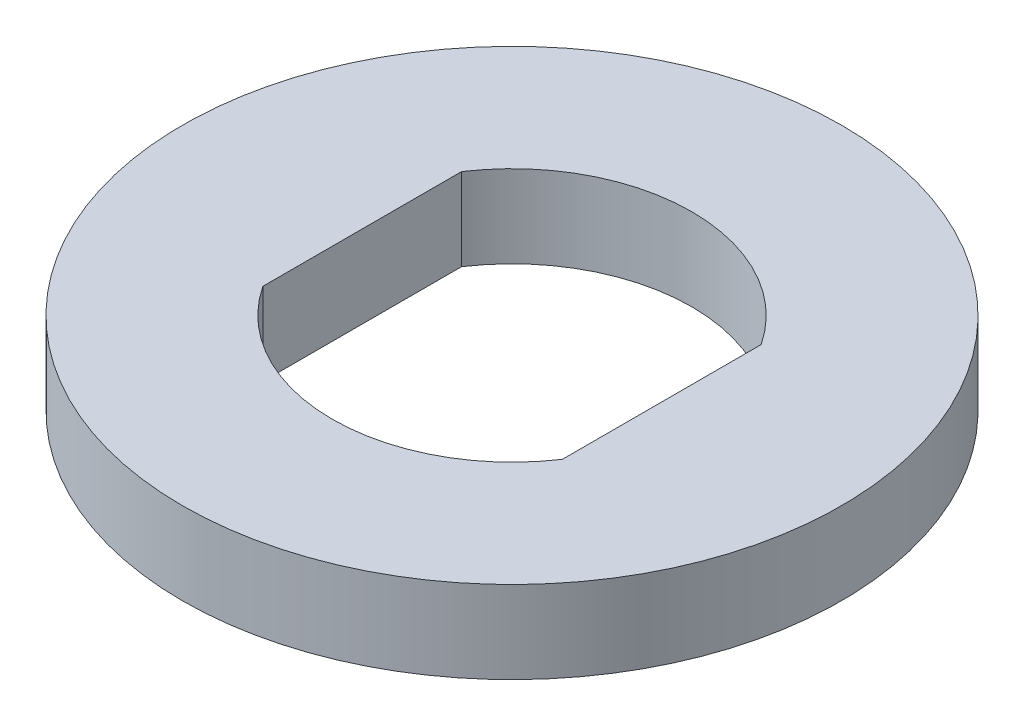
ISO-10303-21;
HEADER;
FILE_DESCRIPTION(('STEP AP214'),'2;1');
FILE_NAME('part.step','',(''),(''),'','','');
FILE_SCHEMA(('AUTOMOTIVE_DESIGN { 1 0 10303 214 1 1 1 1 }'));
ENDSEC;
DATA;
#1=APPLICATION_CONTEXT('core data for automotive mechanical design processes');
#2=APPLICATION_PROTOCOL_DEFINITION('international standard','automotive_design',2000,#1);
#3=PRODUCT_CONTEXT('',#1,'mechanical');
#4=PRODUCT('Part','Part','',(#3));
#5=PRODUCT_RELATED_PRODUCT_CATEGORY('part','',(#4));
#6=PRODUCT_DEFINITION_FORMATION('','',#4);
#7=PRODUCT_DEFINITION_CONTEXT('part definition',#1,'design');
#8=PRODUCT_DEFINITION('design','',#6,#7);
#9=PRODUCT_DEFINITION_SHAPE('','',#8);
#10=(LENGTH_UNIT() NAMED_UNIT(*) SI_UNIT(.MILLI.,.METRE.));
#11=(NAMED_UNIT(*) PLANE_ANGLE_UNIT() SI_UNIT($,.RADIAN.));
#12=(NAMED_UNIT(*) SI_UNIT($,.STERADIAN.) SOLID_ANGLE_UNIT());
#13=UNCERTAINTY_MEASURE_WITH_UNIT(LENGTH_MEASURE(1.E-05),#10,'distance_accuracy_value','');
#14=(GEOMETRIC_REPRESENTATION_CONTEXT(3) GLOBAL_UNCERTAINTY_ASSIGNED_CONTEXT((#13)) GLOBAL_UNIT_ASSIGNED_CONTEXT((#10,
#11,#12)) REPRESENTATION_CONTEXT('',''));
#15=CARTESIAN_POINT('',(0.,0.,0.));
#16=DIRECTION('',(0.,0.,1.));
#17=DIRECTION('',(1.,0.,0.));
#18=AXIS2_PLACEMENT_3D('',#15,#16,#17);
#19=CARTESIAN_POINT('',(0.,1.375,0.));
#20=DIRECTION('',(0.,1.,0.));
#21=DIRECTION('',(0.,0.,1.));
#22=AXIS2_PLACEMENT_3D('',#19,#20,#21);
#23=PLANE('',#22);
#24=CARTESIAN_POINT('',(0.,1.375,0.));
#25=DIRECTION('',(0.,1.,0.));
#26=DIRECTION('',(0.,0.,1.));
#27=AXIS2_PLACEMENT_3D('',#24,#25,#26);
#28=CIRCLE('',#27,11.);
#29=CARTESIAN_POINT('',(0.,1.375,11.));
#30=VERTEX_POINT('',#29);
#31=EDGE_CURVE('E11',#30,#30,#28,.T.);
#32=ORIENTED_EDGE('',*,*,#31,.T.);
#33=EDGE_LOOP('',(#32));
#34=FACE_BOUND('',#33,.T.);
#35=DIRECTION('',(0.,0.,1.));
#36=VECTOR('',#35,1.);
#37=CARTESIAN_POINT('',(-5.,1.375,-3.3166247903554));
#38=LINE('',#37,#36);
#39=CARTESIAN_POINT('',(-5.,1.375,-3.3166247903554));
#40=VERTEX_POINT('',#39);
#41=CARTESIAN_POINT('',(-5.,1.375,3.3166247903554));
#42=VERTEX_POINT('',#41);
#43=EDGE_CURVE('E90',#40,#42,#38,.T.);
#44=ORIENTED_EDGE('',*,*,#43,.F.);
#45=CARTESIAN_POINT('',(0.,1.375,0.));
#46=DIRECTION('',(0.,1.,0.));
#47=DIRECTION('',(0.,0.,1.));
#48=AXIS2_PLACEMENT_3D('',#45,#46,#47);
#49=CIRCLE('',#48,6.);
#50=CARTESIAN_POINT('',(5.,1.375,-3.3166247903554));
#51=VERTEX_POINT('',#50);
#52=EDGE_CURVE('E81',#51,#40,#49,.T.);
#53=ORIENTED_EDGE('',*,*,#52,.F.);
#54=DIRECTION('',(0.,0.,-1.));
#55=VECTOR('',#54,1.);
#56=CARTESIAN_POINT('',(5.,1.375,3.3166247903554));
#57=LINE('',#56,#55);
#58=CARTESIAN_POINT('',(5.,1.375,3.3166247903554));
#59=VERTEX_POINT('',#58);
#60=EDGE_CURVE('E106',#59,#51,#57,.T.);
#61=ORIENTED_EDGE('',*,*,#60,.F.);
#62=CARTESIAN_POINT('',(0.,1.375,0.));
#63=DIRECTION('',(0.,1.,0.));
#64=DIRECTION('',(0.,0.,1.));
#65=AXIS2_PLACEMENT_3D('',#62,#63,#64);
#66=CIRCLE('',#65,6.);
#67=EDGE_CURVE('E102',#42,#59,#66,.T.);
#68=ORIENTED_EDGE('',*,*,#67,.F.);
#69=EDGE_LOOP('',(#44,#53,#61,#68));
#70=FACE_BOUND('',#69,.T.);
#71=ADVANCED_FACE('F39',(#34,#70),#23,.T.);
#72=CARTESIAN_POINT('',(0.,-1.375,0.));
#73=DIRECTION('',(0.,1.,0.));
#74=DIRECTION('',(0.,0.,1.));
#75=AXIS2_PLACEMENT_3D('',#72,#73,#74);
#76=PLANE('',#75);
#77=CARTESIAN_POINT('',(0.,-1.375,0.));
#78=DIRECTION('',(0.,1.,0.));
#79=DIRECTION('',(0.,0.,1.));
#80=AXIS2_PLACEMENT_3D('',#77,#78,#79);
#81=CIRCLE('',#80,11.);
#82=CARTESIAN_POINT('',(0.,-1.375,11.));
#83=VERTEX_POINT('',#82);
#84=EDGE_CURVE('E43',#83,#83,#81,.T.);
#85=ORIENTED_EDGE('',*,*,#84,.F.);
#86=EDGE_LOOP('',(#85));
#87=FACE_BOUND('',#86,.T.);
#88=CARTESIAN_POINT('',(0.,-1.375,0.));
#89=DIRECTION('',(0.,1.,0.));
#90=DIRECTION('',(0.,0.,1.));
#91=AXIS2_PLACEMENT_3D('',#88,#89,#90);
#92=CIRCLE('',#91,6.);
#93=CARTESIAN_POINT('',(5.,-1.375,-3.3166247903554));
#94=VERTEX_POINT('',#93);
#95=CARTESIAN_POINT('',(-5.,-1.375,-3.3166247903554));
#96=VERTEX_POINT('',#95);
#97=EDGE_CURVE('E63',#94,#96,#92,.T.);
#98=ORIENTED_EDGE('',*,*,#97,.T.);
#99=DIRECTION('',(0.,0.,1.));
#100=VECTOR('',#99,1.);
#101=CARTESIAN_POINT('',(-5.,-1.375,-3.3166247903554));
#102=LINE('',#101,#100);
#103=CARTESIAN_POINT('',(-5.,-1.375,3.3166247903554));
#104=VERTEX_POINT('',#103);
#105=EDGE_CURVE('E97',#96,#104,#102,.T.);
#106=ORIENTED_EDGE('',*,*,#105,.T.);
#107=CARTESIAN_POINT('',(0.,-1.375,0.));
#108=DIRECTION('',(0.,1.,0.));
#109=DIRECTION('',(0.,0.,1.));
#110=AXIS2_PLACEMENT_3D('',#107,#108,#109);
#111=CIRCLE('',#110,6.);
#112=CARTESIAN_POINT('',(5.,-1.375,3.3166247903554));
#113=VERTEX_POINT('',#112);
#114=EDGE_CURVE('E115',#104,#113,#111,.T.);
#115=ORIENTED_EDGE('',*,*,#114,.T.);
#116=DIRECTION('',(0.,0.,-1.));
#117=VECTOR('',#116,1.);
#118=CARTESIAN_POINT('',(5.,-1.375,3.3166247903554));
#119=LINE('',#118,#117);
#120=EDGE_CURVE('E91',#113,#94,#119,.T.);
#121=ORIENTED_EDGE('',*,*,#120,.T.);
#122=EDGE_LOOP('',(#98,#106,#115,#121));
#123=FACE_BOUND('',#122,.T.);
#124=ADVANCED_FACE('F131',(#87,#123),#76,.F.);
#125=CARTESIAN_POINT('',(0.,1.375,0.));
#126=DIRECTION('',(0.,-1.,0.));
#127=DIRECTION('',(0.,0.,-1.));
#128=AXIS2_PLACEMENT_3D('',#125,#126,#127);
#129=CYLINDRICAL_SURFACE('',#128,11.);
#130=ORIENTED_EDGE('',*,*,#31,.F.);
#131=EDGE_LOOP('',(#130));
#132=FACE_BOUND('',#131,.T.);
#133=ORIENTED_EDGE('',*,*,#84,.T.);
#134=EDGE_LOOP('',(#133));
#135=FACE_BOUND('',#134,.T.);
#136=ADVANCED_FACE('F41',(#132,#135),#129,.T.);
#137=CARTESIAN_POINT('',(0.,1.375,0.));
#138=DIRECTION('',(0.,-1.,0.));
#139=DIRECTION('',(0.,0.,-1.));
#140=AXIS2_PLACEMENT_3D('',#137,#138,#139);
#141=CYLINDRICAL_SURFACE('',#140,6.);
#142=ORIENTED_EDGE('',*,*,#97,.F.);
#143=DIRECTION('',(0.,-1.,0.));
#144=VECTOR('',#143,1.);
#145=CARTESIAN_POINT('',(5.,1.375,-3.3166247903554));
#146=LINE('',#145,#144);
#147=EDGE_CURVE('E85',#51,#94,#146,.T.);
#148=ORIENTED_EDGE('',*,*,#147,.F.);
#149=ORIENTED_EDGE('',*,*,#52,.T.);
#150=DIRECTION('',(0.,-1.,0.));
#151=VECTOR('',#150,1.);
#152=CARTESIAN_POINT('',(-5.,1.375,-3.3166247903554));
#153=LINE('',#152,#151);
#154=EDGE_CURVE('E84',#40,#96,#153,.T.);
#155=ORIENTED_EDGE('',*,*,#154,.T.);
#156=EDGE_LOOP('',(#142,#148,#149,#155));
#157=FACE_BOUND('',#156,.T.);
#158=ADVANCED_FACE('F83',(#157),#141,.F.);
#159=CARTESIAN_POINT('',(-5.,1.375,-3.3166247903554));
#160=DIRECTION('',(1.,0.,0.));
#161=DIRECTION('',(0.,0.,-1.));
#162=AXIS2_PLACEMENT_3D('',#159,#160,#161);
#163=PLANE('',#162);
#164=ORIENTED_EDGE('',*,*,#105,.F.);
#165=ORIENTED_EDGE('',*,*,#154,.F.);
#166=ORIENTED_EDGE('',*,*,#43,.T.);
#167=DIRECTION('',(0.,-1.,0.));
#168=VECTOR('',#167,1.);
#169=CARTESIAN_POINT('',(-5.,1.375,3.3166247903554));
#170=LINE('',#169,#168);
#171=EDGE_CURVE('E99',#42,#104,#170,.T.);
#172=ORIENTED_EDGE('',*,*,#171,.T.);
#173=EDGE_LOOP('',(#164,#165,#166,#172));
#174=FACE_BOUND('',#173,.T.);
#175=ADVANCED_FACE('F94',(#174),#163,.T.);
#176=CARTESIAN_POINT('',(0.,1.375,0.));
#177=DIRECTION('',(0.,-1.,0.));
#178=DIRECTION('',(0.,0.,-1.));
#179=AXIS2_PLACEMENT_3D('',#176,#177,#178);
#180=CYLINDRICAL_SURFACE('',#179,6.);
#181=ORIENTED_EDGE('',*,*,#114,.F.);
#182=ORIENTED_EDGE('',*,*,#171,.F.);
#183=ORIENTED_EDGE('',*,*,#67,.T.);
#184=DIRECTION('',(0.,-1.,0.));
#185=VECTOR('',#184,1.);
#186=CARTESIAN_POINT('',(5.,1.375,3.3166247903554));
#187=LINE('',#186,#185);
#188=EDGE_CURVE('E55',#59,#113,#187,.T.);
#189=ORIENTED_EDGE('',*,*,#188,.T.);
#190=EDGE_LOOP('',(#181,#182,#183,#189));
#191=FACE_BOUND('',#190,.T.);
#192=ADVANCED_FACE('F129',(#191),#180,.F.);
#193=CARTESIAN_POINT('',(5.,1.375,3.3166247903554));
#194=DIRECTION('',(-1.,0.,0.));
#195=DIRECTION('',(0.,0.,1.));
#196=AXIS2_PLACEMENT_3D('',#193,#194,#195);
#197=PLANE('',#196);
#198=ORIENTED_EDGE('',*,*,#120,.F.);
#199=ORIENTED_EDGE('',*,*,#188,.F.);
#200=ORIENTED_EDGE('',*,*,#60,.T.);
#201=ORIENTED_EDGE('',*,*,#147,.T.);
#202=EDGE_LOOP('',(#198,#199,#200,#201));
#203=FACE_BOUND('',#202,.T.);
#204=ADVANCED_FACE('F132',(#203),#197,.T.);
#205=CLOSED_SHELL('',(#71,#124,#136,#158,#175,#192,#204));
#206=MANIFOLD_SOLID_BREP('B2',#205);
#207=ADVANCED_BREP_SHAPE_REPRESENTATION('',(#18,#206),#14);
#208=SHAPE_DEFINITION_REPRESENTATION(#9,#207);
ENDSEC;
END-ISO-10303-21;
